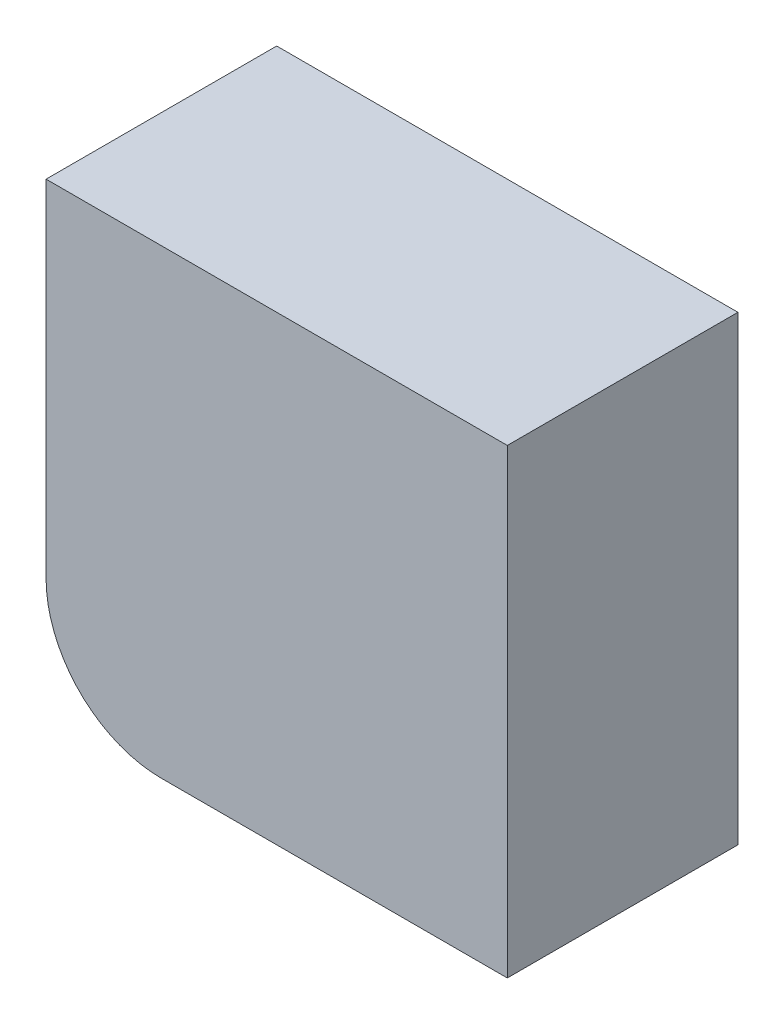
ISO-10303-21;
HEADER;
FILE_DESCRIPTION(('STEP AP214'),'2;1');
FILE_NAME('part.step','',(''),(''),'','','');
FILE_SCHEMA(('AUTOMOTIVE_DESIGN { 1 0 10303 214 1 1 1 1 }'));
ENDSEC;
DATA;
#1=APPLICATION_CONTEXT('core data for automotive mechanical design processes');
#2=APPLICATION_PROTOCOL_DEFINITION('international standard','automotive_design',2000,#1);
#3=PRODUCT_CONTEXT('',#1,'mechanical');
#4=PRODUCT('Part','Part','',(#3));
#5=PRODUCT_RELATED_PRODUCT_CATEGORY('part','',(#4));
#6=PRODUCT_DEFINITION_FORMATION('','',#4);
#7=PRODUCT_DEFINITION_CONTEXT('part definition',#1,'design');
#8=PRODUCT_DEFINITION('design','',#6,#7);
#9=PRODUCT_DEFINITION_SHAPE('','',#8);
#10=(LENGTH_UNIT() NAMED_UNIT(*) SI_UNIT(.MILLI.,.METRE.));
#11=(NAMED_UNIT(*) PLANE_ANGLE_UNIT() SI_UNIT($,.RADIAN.));
#12=(NAMED_UNIT(*) SI_UNIT($,.STERADIAN.) SOLID_ANGLE_UNIT());
#13=UNCERTAINTY_MEASURE_WITH_UNIT(LENGTH_MEASURE(1.E-05),#10,'distance_accuracy_value','');
#14=(GEOMETRIC_REPRESENTATION_CONTEXT(3) GLOBAL_UNCERTAINTY_ASSIGNED_CONTEXT((#13)) GLOBAL_UNIT_ASSIGNED_CONTEXT((#10,
#11,#12)) REPRESENTATION_CONTEXT('',''));
#15=CARTESIAN_POINT('',(0.,0.,0.));
#16=DIRECTION('',(0.,0.,1.));
#17=DIRECTION('',(1.,0.,0.));
#18=AXIS2_PLACEMENT_3D('',#15,#16,#17);
#19=CARTESIAN_POINT('',(0.,0.,10.));
#20=DIRECTION('',(1.,0.,0.));
#21=DIRECTION('',(0.,0.,-1.));
#22=AXIS2_PLACEMENT_3D('',#19,#20,#21);
#23=PLANE('',#22);
#24=DIRECTION('',(0.,-1.,0.));
#25=VECTOR('',#24,1.);
#26=CARTESIAN_POINT('',(0.,0.,0.));
#27=LINE('',#26,#25);
#28=CARTESIAN_POINT('',(0.,20.,0.));
#29=VERTEX_POINT('',#28);
#30=CARTESIAN_POINT('',(0.,5.,0.));
#31=VERTEX_POINT('',#30);
#32=EDGE_CURVE('E120',#29,#31,#27,.T.);
#33=ORIENTED_EDGE('',*,*,#32,.T.);
#34=DIRECTION('',(0.,0.,-1.));
#35=VECTOR('',#34,1.);
#36=CARTESIAN_POINT('',(0.,5.,10.));
#37=LINE('',#36,#35);
#38=CARTESIAN_POINT('',(0.,5.,10.));
#39=VERTEX_POINT('',#38);
#40=EDGE_CURVE('E51',#31,#39,#37,.F.);
#41=ORIENTED_EDGE('',*,*,#40,.T.);
#42=DIRECTION('',(0.,-1.,0.));
#43=VECTOR('',#42,1.);
#44=CARTESIAN_POINT('',(0.,0.,10.));
#45=LINE('',#44,#43);
#46=CARTESIAN_POINT('',(0.,20.,10.));
#47=VERTEX_POINT('',#46);
#48=EDGE_CURVE('E97',#47,#39,#45,.T.);
#49=ORIENTED_EDGE('',*,*,#48,.F.);
#50=DIRECTION('',(0.,0.,-1.));
#51=VECTOR('',#50,1.);
#52=CARTESIAN_POINT('',(0.,20.,10.));
#53=LINE('',#52,#51);
#54=EDGE_CURVE('E113',#47,#29,#53,.T.);
#55=ORIENTED_EDGE('',*,*,#54,.T.);
#56=EDGE_LOOP('',(#33,#41,#49,#55));
#57=FACE_BOUND('',#56,.T.);
#58=ADVANCED_FACE('F43',(#57),#23,.F.);
#59=CARTESIAN_POINT('',(0.,0.,10.));
#60=DIRECTION('',(0.,1.,0.));
#61=DIRECTION('',(0.,0.,1.));
#62=AXIS2_PLACEMENT_3D('',#59,#60,#61);
#63=PLANE('',#62);
#64=DIRECTION('',(1.,0.,0.));
#65=VECTOR('',#64,1.);
#66=CARTESIAN_POINT('',(0.,0.,10.));
#67=LINE('',#66,#65);
#68=CARTESIAN_POINT('',(5.,0.,10.));
#69=VERTEX_POINT('',#68);
#70=CARTESIAN_POINT('',(20.,0.,10.));
#71=VERTEX_POINT('',#70);
#72=EDGE_CURVE('E90',#69,#71,#67,.T.);
#73=ORIENTED_EDGE('',*,*,#72,.F.);
#74=DIRECTION('',(0.,0.,-1.));
#75=VECTOR('',#74,1.);
#76=CARTESIAN_POINT('',(5.,0.,10.));
#77=LINE('',#76,#75);
#78=CARTESIAN_POINT('',(5.,0.,0.));
#79=VERTEX_POINT('',#78);
#80=EDGE_CURVE('E110',#69,#79,#77,.T.);
#81=ORIENTED_EDGE('',*,*,#80,.T.);
#82=DIRECTION('',(1.,0.,0.));
#83=VECTOR('',#82,1.);
#84=CARTESIAN_POINT('',(0.,0.,0.));
#85=LINE('',#84,#83);
#86=CARTESIAN_POINT('',(20.,0.,0.));
#87=VERTEX_POINT('',#86);
#88=EDGE_CURVE('E102',#79,#87,#85,.T.);
#89=ORIENTED_EDGE('',*,*,#88,.T.);
#90=DIRECTION('',(0.,0.,-1.));
#91=VECTOR('',#90,1.);
#92=CARTESIAN_POINT('',(20.,0.,10.));
#93=LINE('',#92,#91);
#94=EDGE_CURVE('E105',#71,#87,#93,.T.);
#95=ORIENTED_EDGE('',*,*,#94,.F.);
#96=EDGE_LOOP('',(#73,#81,#89,#95));
#97=FACE_BOUND('',#96,.T.);
#98=ADVANCED_FACE('F103',(#97),#63,.F.);
#99=CARTESIAN_POINT('',(20.,0.,10.));
#100=DIRECTION('',(-1.,0.,0.));
#101=DIRECTION('',(0.,0.,1.));
#102=AXIS2_PLACEMENT_3D('',#99,#100,#101);
#103=PLANE('',#102);
#104=DIRECTION('',(0.,1.,0.));
#105=VECTOR('',#104,1.);
#106=CARTESIAN_POINT('',(20.,0.,0.));
#107=LINE('',#106,#105);
#108=CARTESIAN_POINT('',(20.,20.,0.));
#109=VERTEX_POINT('',#108);
#110=EDGE_CURVE('E124',#87,#109,#107,.T.);
#111=ORIENTED_EDGE('',*,*,#110,.T.);
#112=DIRECTION('',(0.,0.,-1.));
#113=VECTOR('',#112,1.);
#114=CARTESIAN_POINT('',(20.,20.,10.));
#115=LINE('',#114,#113);
#116=CARTESIAN_POINT('',(20.,20.,10.));
#117=VERTEX_POINT('',#116);
#118=EDGE_CURVE('E107',#117,#109,#115,.T.);
#119=ORIENTED_EDGE('',*,*,#118,.F.);
#120=DIRECTION('',(0.,1.,0.));
#121=VECTOR('',#120,1.);
#122=CARTESIAN_POINT('',(20.,0.,10.));
#123=LINE('',#122,#121);
#124=EDGE_CURVE('E91',#71,#117,#123,.T.);
#125=ORIENTED_EDGE('',*,*,#124,.F.);
#126=ORIENTED_EDGE('',*,*,#94,.T.);
#127=EDGE_LOOP('',(#111,#119,#125,#126));
#128=FACE_BOUND('',#127,.T.);
#129=ADVANCED_FACE('F109',(#128),#103,.F.);
#130=CARTESIAN_POINT('',(0.,20.,10.));
#131=DIRECTION('',(0.,-1.,0.));
#132=DIRECTION('',(0.,0.,-1.));
#133=AXIS2_PLACEMENT_3D('',#130,#131,#132);
#134=PLANE('',#133);
#135=DIRECTION('',(-1.,0.,0.));
#136=VECTOR('',#135,1.);
#137=CARTESIAN_POINT('',(0.,20.,0.));
#138=LINE('',#137,#136);
#139=EDGE_CURVE('E121',#109,#29,#138,.T.);
#140=ORIENTED_EDGE('',*,*,#139,.T.);
#141=ORIENTED_EDGE('',*,*,#54,.F.);
#142=DIRECTION('',(-1.,0.,0.));
#143=VECTOR('',#142,1.);
#144=CARTESIAN_POINT('',(0.,20.,10.));
#145=LINE('',#144,#143);
#146=EDGE_CURVE('E114',#117,#47,#145,.T.);
#147=ORIENTED_EDGE('',*,*,#146,.F.);
#148=ORIENTED_EDGE('',*,*,#118,.T.);
#149=EDGE_LOOP('',(#140,#141,#147,#148));
#150=FACE_BOUND('',#149,.T.);
#151=ADVANCED_FACE('F135',(#150),#134,.F.);
#152=CARTESIAN_POINT('',(0.,0.,10.));
#153=DIRECTION('',(0.,0.,-1.));
#154=DIRECTION('',(-1.,0.,0.));
#155=AXIS2_PLACEMENT_3D('',#152,#153,#154);
#156=PLANE('',#155);
#157=ORIENTED_EDGE('',*,*,#48,.T.);
#158=CARTESIAN_POINT('',(5.,5.,10.));
#159=DIRECTION('',(0.,0.,-1.));
#160=DIRECTION('',(-1.,0.,0.));
#161=AXIS2_PLACEMENT_3D('',#158,#159,#160);
#162=CIRCLE('',#161,5.);
#163=EDGE_CURVE('E11',#39,#69,#162,.F.);
#164=ORIENTED_EDGE('',*,*,#163,.T.);
#165=ORIENTED_EDGE('',*,*,#72,.T.);
#166=ORIENTED_EDGE('',*,*,#124,.T.);
#167=ORIENTED_EDGE('',*,*,#146,.T.);
#168=EDGE_LOOP('',(#157,#164,#165,#166,#167));
#169=FACE_BOUND('',#168,.T.);
#170=ADVANCED_FACE('F93',(#169),#156,.F.);
#171=CARTESIAN_POINT('',(0.,0.,0.));
#172=DIRECTION('',(0.,0.,-1.));
#173=DIRECTION('',(-1.,0.,0.));
#174=AXIS2_PLACEMENT_3D('',#171,#172,#173);
#175=PLANE('',#174);
#176=ORIENTED_EDGE('',*,*,#88,.F.);
#177=CARTESIAN_POINT('',(5.,5.,0.));
#178=DIRECTION('',(0.,0.,-1.));
#179=DIRECTION('',(-1.,0.,0.));
#180=AXIS2_PLACEMENT_3D('',#177,#178,#179);
#181=CIRCLE('',#180,5.);
#182=EDGE_CURVE('E61',#79,#31,#181,.T.);
#183=ORIENTED_EDGE('',*,*,#182,.T.);
#184=ORIENTED_EDGE('',*,*,#32,.F.);
#185=ORIENTED_EDGE('',*,*,#139,.F.);
#186=ORIENTED_EDGE('',*,*,#110,.F.);
#187=EDGE_LOOP('',(#176,#183,#184,#185,#186));
#188=FACE_BOUND('',#187,.T.);
#189=ADVANCED_FACE('F133',(#188),#175,.T.);
#190=CARTESIAN_POINT('',(5.,5.,10.));
#191=DIRECTION('',(0.,0.,-1.));
#192=DIRECTION('',(-1.,0.,0.));
#193=AXIS2_PLACEMENT_3D('',#190,#191,#192);
#194=CYLINDRICAL_SURFACE('',#193,5.);
#195=ORIENTED_EDGE('',*,*,#163,.F.);
#196=ORIENTED_EDGE('',*,*,#40,.F.);
#197=ORIENTED_EDGE('',*,*,#182,.F.);
#198=ORIENTED_EDGE('',*,*,#80,.F.);
#199=EDGE_LOOP('',(#195,#196,#197,#198));
#200=FACE_BOUND('',#199,.T.);
#201=ADVANCED_FACE('F44',(#200),#194,.T.);
#202=CLOSED_SHELL('',(#58,#98,#129,#151,#170,#189,#201));
#203=MANIFOLD_SOLID_BREP('B2',#202);
#204=ADVANCED_BREP_SHAPE_REPRESENTATION('',(#18,#203),#14);
#205=SHAPE_DEFINITION_REPRESENTATION(#9,#204);
ENDSEC;
END-ISO-10303-21;
